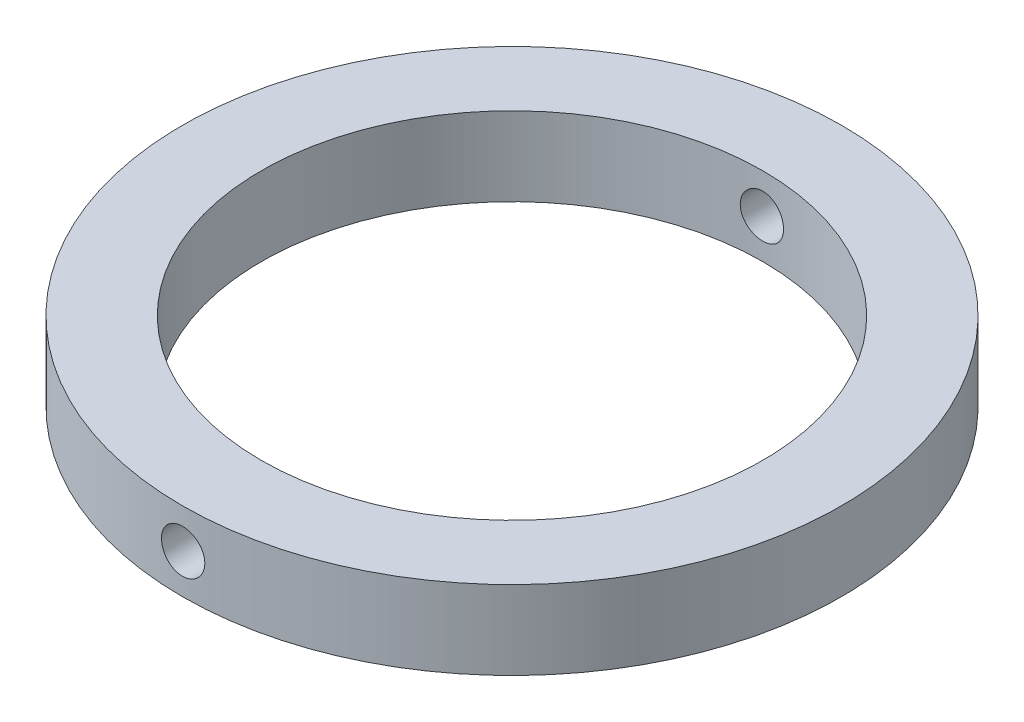
ISO-10303-21;
HEADER;
FILE_DESCRIPTION(('STEP AP214'),'2;1');
FILE_NAME('part.step','',(''),(''),'','','');
FILE_SCHEMA(('AUTOMOTIVE_DESIGN { 1 0 10303 214 1 1 1 1 }'));
ENDSEC;
DATA;
#1=APPLICATION_CONTEXT('core data for automotive mechanical design processes');
#2=APPLICATION_PROTOCOL_DEFINITION('international standard','automotive_design',2000,#1);
#3=PRODUCT_CONTEXT('',#1,'mechanical');
#4=PRODUCT('Part','Part','',(#3));
#5=PRODUCT_RELATED_PRODUCT_CATEGORY('part','',(#4));
#6=PRODUCT_DEFINITION_FORMATION('','',#4);
#7=PRODUCT_DEFINITION_CONTEXT('part definition',#1,'design');
#8=PRODUCT_DEFINITION('design','',#6,#7);
#9=PRODUCT_DEFINITION_SHAPE('','',#8);
#10=(LENGTH_UNIT() NAMED_UNIT(*) SI_UNIT(.MILLI.,.METRE.));
#11=(NAMED_UNIT(*) PLANE_ANGLE_UNIT() SI_UNIT($,.RADIAN.));
#12=(NAMED_UNIT(*) SI_UNIT($,.STERADIAN.) SOLID_ANGLE_UNIT());
#13=UNCERTAINTY_MEASURE_WITH_UNIT(LENGTH_MEASURE(1.E-05),#10,'distance_accuracy_value','');
#14=(GEOMETRIC_REPRESENTATION_CONTEXT(3) GLOBAL_UNCERTAINTY_ASSIGNED_CONTEXT((#13)) GLOBAL_UNIT_ASSIGNED_CONTEXT((#10,
#11,#12)) REPRESENTATION_CONTEXT('',''));
#15=CARTESIAN_POINT('',(0.,0.,0.));
#16=DIRECTION('',(0.,0.,1.));
#17=DIRECTION('',(1.,0.,0.));
#18=AXIS2_PLACEMENT_3D('',#15,#16,#17);
#19=CARTESIAN_POINT('',(0.,10.,0.));
#20=DIRECTION('',(0.,-1.,0.));
#21=DIRECTION('',(0.,0.,-1.));
#22=AXIS2_PLACEMENT_3D('',#19,#20,#21);
#23=CYLINDRICAL_SURFACE('',#22,41.85);
#24=CARTESIAN_POINT('',(0.,10.,0.));
#25=DIRECTION('',(0.,1.,0.));
#26=DIRECTION('',(0.,0.,1.));
#27=AXIS2_PLACEMENT_3D('',#24,#25,#26);
#28=CIRCLE('',#27,41.85);
#29=CARTESIAN_POINT('',(0.,10.,41.85));
#30=VERTEX_POINT('',#29);
#31=EDGE_CURVE('E10',#30,#30,#28,.T.);
#32=ORIENTED_EDGE('',*,*,#31,.F.);
#33=EDGE_LOOP('',(#32));
#34=FACE_BOUND('',#33,.T.);
#35=CARTESIAN_POINT('',(0.,0.,0.));
#36=DIRECTION('',(0.,1.,0.));
#37=DIRECTION('',(0.,0.,1.));
#38=AXIS2_PLACEMENT_3D('',#35,#36,#37);
#39=CIRCLE('',#38,41.85);
#40=CARTESIAN_POINT('',(0.,0.,41.85));
#41=VERTEX_POINT('',#40);
#42=EDGE_CURVE('E52',#41,#41,#39,.T.);
#43=ORIENTED_EDGE('',*,*,#42,.T.);
#44=EDGE_LOOP('',(#43));
#45=FACE_BOUND('',#44,.T.);
#46=CARTESIAN_POINT('',(0.,7.75,-41.85));
#47=CARTESIAN_POINT('',(0.154290099332612,7.74999321754741,-41.8499988011758));
#48=CARTESIAN_POINT('',(0.308687825769506,7.73697157858766,-41.8491376375957));
#49=CARTESIAN_POINT('',(0.613218841201266,7.68521323826535,-41.8457850773138));
#50=CARTESIAN_POINT('',(0.763346973857226,7.64644671476278,-41.8432917900545));
#51=CARTESIAN_POINT('',(1.05488365405529,7.54431791111544,-41.8369569989291));
#52=CARTESIAN_POINT('',(1.19629680024165,7.48096873354768,-41.8331162133853));
#53=CARTESIAN_POINT('',(1.46644583797839,7.33149442391011,-41.8245182357857));
#54=CARTESIAN_POINT('',(1.59518459769578,7.24537446111875,-41.8197612517859));
#55=CARTESIAN_POINT('',(1.83657817459748,7.05264884275964,-41.8098567335951));
#56=CARTESIAN_POINT('',(1.94920943303032,6.94601370536758,-41.804708643878));
#57=CARTESIAN_POINT('',(2.15498922700986,6.71534579064044,-41.7946068640215));
#58=CARTESIAN_POINT('',(2.24813694296539,6.59131228179512,-41.7896531820671));
#59=CARTESIAN_POINT('',(2.41237951241051,6.32923328148415,-41.7804945168638));
#60=CARTESIAN_POINT('',(2.48345457634963,6.19117536253465,-41.7762902069053));
#61=CARTESIAN_POINT('',(2.60140770033902,5.90505354364975,-41.7691116752754));
#62=CARTESIAN_POINT('',(2.64828604313305,5.75698976065784,-41.7661374392305));
#63=CARTESIAN_POINT('',(2.71644905753053,5.45528799244626,-41.7617598003493));
#64=CARTESIAN_POINT('',(2.73777093124992,5.30165844590535,-41.7603541144079));
#65=CARTESIAN_POINT('',(2.75433061301864,4.99299495634095,-41.7592652613331));
#66=CARTESIAN_POINT('',(2.74956874274023,4.8379610306602,-41.7595820729574));
#67=CARTESIAN_POINT('',(2.71412695981282,4.53114331553306,-41.7619003689473));
#68=CARTESIAN_POINT('',(2.683487327807,4.37935485056886,-41.7638992350534));
#69=CARTESIAN_POINT('',(2.59722226061068,4.08308011249805,-41.769352265633));
#70=CARTESIAN_POINT('',(2.54159666285057,3.9385938869098,-41.7728064395754));
#71=CARTESIAN_POINT('',(2.40689302759663,3.6608957926856,-41.7807838468435));
#72=CARTESIAN_POINT('',(2.32779674482857,3.5276927991685,-41.7853079113064));
#73=CARTESIAN_POINT('',(2.1484102038833,3.27643934494015,-41.7949144584274));
#74=CARTESIAN_POINT('',(2.04811968150902,3.15838907314484,-41.7999969480461));
#75=CARTESIAN_POINT('',(1.82896480218378,2.94055773694956,-41.8101592283428));
#76=CARTESIAN_POINT('',(1.71006558988451,2.8408117352164,-41.8152389956332));
#77=CARTESIAN_POINT('',(1.4571905540584,2.66269090365282,-41.8248141399912));
#78=CARTESIAN_POINT('',(1.32321472472832,2.58431608204856,-41.829309516834));
#79=CARTESIAN_POINT('',(1.04396806424317,2.45116524605297,-41.8372097464952));
#80=CARTESIAN_POINT('',(0.898696583449396,2.39639059014784,-41.8406145365338));
#81=CARTESIAN_POINT('',(0.600991973656429,2.31201851186089,-41.8459491056359));
#82=CARTESIAN_POINT('',(0.44855893711889,2.2824207645184,-41.8478789037373));
#83=CARTESIAN_POINT('',(0.141162405527342,2.24928619099311,-41.8500435844614));
#84=CARTESIAN_POINT('',(-0.0137958435674341,2.24570089380397,-41.8502816194599));
#85=CARTESIAN_POINT('',(-0.322111494498557,2.26456630211203,-41.8490443411495));
#86=CARTESIAN_POINT('',(-0.475468905551681,2.28701685762509,-41.8475690377105));
#87=CARTESIAN_POINT('',(-0.776092853861847,2.35727654288242,-41.8430731701016));
#88=CARTESIAN_POINT('',(-0.923364617797856,2.40506340308875,-41.8400539630403));
#89=CARTESIAN_POINT('',(-1.20779816693384,2.52461656904448,-41.8328098889319));
#90=CARTESIAN_POINT('',(-1.34495985170388,2.59638311296036,-41.8285850099103));
#91=CARTESIAN_POINT('',(-1.60550150430209,2.76198163226646,-41.8193963040407));
#92=CARTESIAN_POINT('',(-1.72886088017293,2.85584594490211,-41.8144313982026));
#93=CARTESIAN_POINT('',(-1.95808882318597,3.06292851796911,-41.8043248823149));
#94=CARTESIAN_POINT('',(-2.06395720041093,3.17614698852076,-41.7991832703473));
#95=CARTESIAN_POINT('',(-2.255362406773,3.41893330820694,-41.7892936761702));
#96=CARTESIAN_POINT('',(-2.34086776488973,3.54852599666441,-41.7845463105478));
#97=CARTESIAN_POINT('',(-2.4889044098989,3.82025741406678,-41.7759904323852));
#98=CARTESIAN_POINT('',(-2.5514358505387,3.96239605904303,-41.772181913562));
#99=CARTESIAN_POINT('',(-2.65169524528746,4.25507012213475,-41.7659376892427));
#100=CARTESIAN_POINT('',(-2.68944293341243,4.40559875586404,-41.7635008917372));
#101=CARTESIAN_POINT('',(-2.73912772853688,4.71087389977274,-41.7602718954646));
#102=CARTESIAN_POINT('',(-2.75106512394346,4.86562036280208,-41.7594796783207));
#103=CARTESIAN_POINT('',(-2.74878763293919,5.17462559078792,-41.7596296300074));
#104=CARTESIAN_POINT('',(-2.73462221841803,5.32888472439922,-41.7605685179271));
#105=CARTESIAN_POINT('',(-2.6806438619129,5.63282899559131,-41.7640679273305));
#106=CARTESIAN_POINT('',(-2.64083087428527,5.78251412503148,-41.7666284516999));
#107=CARTESIAN_POINT('',(-2.53669886815668,6.07306820030999,-41.7730817810187));
#108=CARTESIAN_POINT('',(-2.472380157137,6.21393725674066,-41.7769745692516));
#109=CARTESIAN_POINT('',(-2.32106902496006,6.48288400887214,-41.7856537102544));
#110=CARTESIAN_POINT('',(-2.23407715953305,6.61096201798146,-41.7904400411222));
#111=CARTESIAN_POINT('',(-2.03970545239938,6.85094240947175,-41.8003775294771));
#112=CARTESIAN_POINT('',(-1.93228965654435,6.96281564381602,-41.8055293201369));
#113=CARTESIAN_POINT('',(-1.70017112323984,7.16698201260253,-41.8156117188951));
#114=CARTESIAN_POINT('',(-1.57546416925335,7.25927035723655,-41.8205422726544));
#115=CARTESIAN_POINT('',(-1.31214821799897,7.42172256832539,-41.8296322322455));
#116=CARTESIAN_POINT('',(-1.17352108598708,7.49185706746362,-41.8337906114939));
#117=CARTESIAN_POINT('',(-0.886531552137562,7.60776872481375,-41.8408541940417));
#118=CARTESIAN_POINT('',(-0.73818075243376,7.65357433825889,-41.8437608605963));
#119=CARTESIAN_POINT('',(-0.490772188367824,7.70765506650704,-41.8472338972108));
#120=CARTESIAN_POINT('',(-0.393312628345785,7.7235138062974,-41.8482665606961));
#121=CARTESIAN_POINT('',(-0.197250043047792,7.74468843311883,-41.8496499948046));
#122=CARTESIAN_POINT('',(-0.098647019538159,7.75000433643335,-41.850000766481));
#123=CARTESIAN_POINT('',(0.,7.75,-41.85));
#124=B_SPLINE_CURVE_WITH_KNOTS('',3,(#46,#47,#48,#49,#50,#51,#52,#53,#54,#55,#56,#57,#58,#59,
#60,#61,#62,#63,#64,#65,#66,#67,#68,#69,#70,#71,#72,#73,#74,#75,#76,#77,#78,#79,#80,#81,#82,#83,
#84,#85,#86,#87,#88,#89,#90,#91,#92,#93,#94,#95,#96,#97,#98,#99,#100,#101,#102,#103,#104,#105,
#106,#107,#108,#109,#110,#111,#112,#113,#114,#115,#116,#117,#118,#119,#120,#121,#122,#123),
.UNSPECIFIED.,.T.,.F.,(4,2,2,2,2,2,2,2,2,2,2,2,2,2,2,2,2,2,2,2,2,2,2,2,2,2,2,2,2,2,2,2,2,2,2,2,
2,2,4),(0.,0.462510171268374,0.925557037819973,1.38835743821623,1.8510528666862,
2.31441825776961,2.77780313677942,3.24160227862634,3.70539600076009,4.1685137631446,
4.63162581423995,5.09401832303994,5.55641384041119,6.01916975346513,6.4819314353491,
6.94557051042958,7.40920976397302,7.87287570221902,8.33653565579533,8.79933141356662,
9.26212450533419,9.72451149430553,10.1869030758461,10.6499755608511,11.1130530735666,
11.5768416937236,12.0406272100314,12.5040429886966,12.9674535890752,13.4299868041329,
13.8925208423395,14.3550490771723,14.8175659762748,15.2809047543452,15.7443567193051,
16.2084204864863,16.6719402795252,16.9676515440041,17.2633623517557),.UNSPECIFIED.);
#125=CARTESIAN_POINT('',(0.,7.75,-41.85));
#126=VERTEX_POINT('',#125);
#127=EDGE_CURVE('E85',#126,#126,#124,.T.);
#128=ORIENTED_EDGE('',*,*,#127,.F.);
#129=EDGE_LOOP('',(#128));
#130=FACE_BOUND('',#129,.T.);
#131=CARTESIAN_POINT('',(0.,2.25,41.85));
#132=CARTESIAN_POINT('',(0.154290099332612,2.25000678245259,41.8499988011758));
#133=CARTESIAN_POINT('',(0.308687825769506,2.26302842141234,41.8491376375957));
#134=CARTESIAN_POINT('',(0.613218841201266,2.31478676173465,41.8457850773138));
#135=CARTESIAN_POINT('',(0.763346973857226,2.35355328523722,41.8432917900545));
#136=CARTESIAN_POINT('',(1.05488365405529,2.45568208888456,41.8369569989291));
#137=CARTESIAN_POINT('',(1.19629680024165,2.51903126645232,41.8331162133853));
#138=CARTESIAN_POINT('',(1.46644583797838,2.66850557608989,41.8245182357857));
#139=CARTESIAN_POINT('',(1.59518459769578,2.75462553888125,41.8197612517859));
#140=CARTESIAN_POINT('',(1.83657817459748,2.94735115724036,41.8098567335951));
#141=CARTESIAN_POINT('',(1.94920943303032,3.05398629463242,41.804708643878));
#142=CARTESIAN_POINT('',(2.15498922700985,3.28465420935956,41.7946068640215));
#143=CARTESIAN_POINT('',(2.24813694296538,3.40868771820488,41.7896531820671));
#144=CARTESIAN_POINT('',(2.41237951241051,3.67076671851585,41.7804945168638));
#145=CARTESIAN_POINT('',(2.48345457634963,3.80882463746535,41.7762902069053));
#146=CARTESIAN_POINT('',(2.60140770033902,4.09494645635025,41.7691116752755));
#147=CARTESIAN_POINT('',(2.64828604313305,4.24301023934216,41.7661374392305));
#148=CARTESIAN_POINT('',(2.71644905753053,4.54471200755374,41.7617598003493));
#149=CARTESIAN_POINT('',(2.73777093124992,4.69834155409465,41.7603541144079));
#150=CARTESIAN_POINT('',(2.75433061301864,5.00700504365905,41.7592652613331));
#151=CARTESIAN_POINT('',(2.74956874274023,5.1620389693398,41.7595820729574));
#152=CARTESIAN_POINT('',(2.71412695981282,5.46885668446694,41.7619003689473));
#153=CARTESIAN_POINT('',(2.683487327807,5.62064514943114,41.7638992350534));
#154=CARTESIAN_POINT('',(2.59722226061068,5.91691988750195,41.769352265633));
#155=CARTESIAN_POINT('',(2.54159666285057,6.0614061130902,41.7728064395754));
#156=CARTESIAN_POINT('',(2.40689302759663,6.3391042073144,41.7807838468435));
#157=CARTESIAN_POINT('',(2.32779674482857,6.4723072008315,41.7853079113064));
#158=CARTESIAN_POINT('',(2.1484102038833,6.72356065505985,41.7949144584274));
#159=CARTESIAN_POINT('',(2.04811968150902,6.84161092685516,41.7999969480461));
#160=CARTESIAN_POINT('',(1.82896480218378,7.05944226305044,41.8101592283428));
#161=CARTESIAN_POINT('',(1.71006558988451,7.1591882647836,41.8152389956332));
#162=CARTESIAN_POINT('',(1.4571905540584,7.33730909634719,41.8248141399912));
#163=CARTESIAN_POINT('',(1.32321472472832,7.41568391795145,41.829309516834));
#164=CARTESIAN_POINT('',(1.04396806424316,7.54883475394703,41.8372097464952));
#165=CARTESIAN_POINT('',(0.898696583449393,7.60360940985217,41.8406145365338));
#166=CARTESIAN_POINT('',(0.600991973656427,7.68798148813911,41.8459491056359));
#167=CARTESIAN_POINT('',(0.448558937118888,7.7175792354816,41.8478789037373));
#168=CARTESIAN_POINT('',(0.141162405527341,7.75071380900689,41.8500435844614));
#169=CARTESIAN_POINT('',(-0.013795843567435,7.75429910619603,41.8502816194599));
#170=CARTESIAN_POINT('',(-0.322111494498558,7.73543369788796,41.8490443411495));
#171=CARTESIAN_POINT('',(-0.475468905551682,7.71298314237491,41.8475690377105));
#172=CARTESIAN_POINT('',(-0.776092853861848,7.64272345711758,41.8430731701016));
#173=CARTESIAN_POINT('',(-0.923364617797856,7.59493659691124,41.8400539630403));
#174=CARTESIAN_POINT('',(-1.20779816693384,7.47538343095552,41.8328098889319));
#175=CARTESIAN_POINT('',(-1.34495985170389,7.40361688703964,41.8285850099103));
#176=CARTESIAN_POINT('',(-1.60550150430209,7.23801836773354,41.8193963040407));
#177=CARTESIAN_POINT('',(-1.72886088017293,7.14415405509789,41.8144313982026));
#178=CARTESIAN_POINT('',(-1.95808882318597,6.93707148203089,41.8043248823149));
#179=CARTESIAN_POINT('',(-2.06395720041093,6.82385301147924,41.7991832703473));
#180=CARTESIAN_POINT('',(-2.255362406773,6.58106669179306,41.7892936761702));
#181=CARTESIAN_POINT('',(-2.34086776488973,6.45147400333559,41.7845463105478));
#182=CARTESIAN_POINT('',(-2.4889044098989,6.17974258593322,41.7759904323852));
#183=CARTESIAN_POINT('',(-2.5514358505387,6.03760394095697,41.772181913562));
#184=CARTESIAN_POINT('',(-2.65169524528746,5.74492987786525,41.7659376892427));
#185=CARTESIAN_POINT('',(-2.68944293341243,5.59440124413596,41.7635008917372));
#186=CARTESIAN_POINT('',(-2.73912772853688,5.28912610022726,41.7602718954646));
#187=CARTESIAN_POINT('',(-2.75106512394346,5.13437963719792,41.7594796783207));
#188=CARTESIAN_POINT('',(-2.74878763293919,4.82537440921208,41.7596296300074));
#189=CARTESIAN_POINT('',(-2.73462221841803,4.67111527560078,41.7605685179271));
#190=CARTESIAN_POINT('',(-2.6806438619129,4.36717100440869,41.7640679273305));
#191=CARTESIAN_POINT('',(-2.64083087428527,4.21748587496852,41.7666284516999));
#192=CARTESIAN_POINT('',(-2.53669886815668,3.92693179969001,41.7730817810187));
#193=CARTESIAN_POINT('',(-2.472380157137,3.78606274325934,41.7769745692516));
#194=CARTESIAN_POINT('',(-2.32106902496006,3.51711599112786,41.7856537102544));
#195=CARTESIAN_POINT('',(-2.23407715953305,3.38903798201854,41.7904400411222));
#196=CARTESIAN_POINT('',(-2.03970545239938,3.14905759052825,41.8003775294771));
#197=CARTESIAN_POINT('',(-1.93228965654435,3.03718435618398,41.8055293201369));
#198=CARTESIAN_POINT('',(-1.70017112323984,2.83301798739747,41.8156117188951));
#199=CARTESIAN_POINT('',(-1.57546416925335,2.74072964276345,41.8205422726544));
#200=CARTESIAN_POINT('',(-1.31214821799897,2.57827743167461,41.8296322322455));
#201=CARTESIAN_POINT('',(-1.17352108598708,2.50814293253638,41.8337906114939));
#202=CARTESIAN_POINT('',(-0.886531552137561,2.39223127518625,41.8408541940417));
#203=CARTESIAN_POINT('',(-0.738180752433758,2.34642566174111,41.8437608605963));
#204=CARTESIAN_POINT('',(-0.490772188367822,2.29234493349296,41.8472338972108));
#205=CARTESIAN_POINT('',(-0.393312628345784,2.2764861937026,41.8482665606961));
#206=CARTESIAN_POINT('',(-0.197250043047792,2.25531156688117,41.8496499948046));
#207=CARTESIAN_POINT('',(-0.0986470195381588,2.24999566356665,41.850000766481));
#208=CARTESIAN_POINT('',(0.,2.25,41.85));
#209=B_SPLINE_CURVE_WITH_KNOTS('',3,(#131,#132,#133,#134,#135,#136,#137,#138,#139,#140,#141,
#142,#143,#144,#145,#146,#147,#148,#149,#150,#151,#152,#153,#154,#155,#156,#157,#158,#159,#160,
#161,#162,#163,#164,#165,#166,#167,#168,#169,#170,#171,#172,#173,#174,#175,#176,#177,#178,#179,
#180,#181,#182,#183,#184,#185,#186,#187,#188,#189,#190,#191,#192,#193,#194,#195,#196,#197,#198,
#199,#200,#201,#202,#203,#204,#205,#206,#207,#208),.UNSPECIFIED.,.T.,.F.,(4,2,2,2,2,2,2,2,2,2,2,
2,2,2,2,2,2,2,2,2,2,2,2,2,2,2,2,2,2,2,2,2,2,2,2,2,2,2,4),(0.,0.462510171268374,
0.925557037819972,1.38835743821623,1.8510528666862,2.31441825776961,2.77780313677942,
3.24160227862634,3.70539600076009,4.1685137631446,4.63162581423995,5.09401832303994,
5.5564138404112,6.01916975346513,6.4819314353491,6.94557051042958,7.40920976397302,
7.87287570221902,8.33653565579533,8.79933141356662,9.26212450533419,9.72451149430552,
10.1869030758461,10.6499755608511,11.1130530735666,11.5768416937236,12.0406272100314,
12.5040429886966,12.9674535890752,13.4299868041329,13.8925208423395,14.3550490771723,
14.8175659762748,15.2809047543452,15.7443567193051,16.2084204864863,16.6719402795252,
16.9676515440041,17.2633623517557),.UNSPECIFIED.);
#210=CARTESIAN_POINT('',(0.,2.25,41.85));
#211=VERTEX_POINT('',#210);
#212=EDGE_CURVE('E80',#211,#211,#209,.T.);
#213=ORIENTED_EDGE('',*,*,#212,.F.);
#214=EDGE_LOOP('',(#213));
#215=FACE_BOUND('',#214,.T.);
#216=ADVANCED_FACE('F39',(#34,#45,#130,#215),#23,.T.);
#217=CARTESIAN_POINT('',(0.,10.,0.));
#218=DIRECTION('',(0.,-1.,0.));
#219=DIRECTION('',(0.,0.,-1.));
#220=AXIS2_PLACEMENT_3D('',#217,#218,#219);
#221=CYLINDRICAL_SURFACE('',#220,31.85);
#222=CARTESIAN_POINT('',(-2.75,5.,31.7310573413494));
#223=CARTESIAN_POINT('',(-2.74999327464815,4.84584049601565,31.7310589144226));
#224=CARTESIAN_POINT('',(-2.73699357154665,4.69157654672714,31.7321928714091));
#225=CARTESIAN_POINT('',(-2.68532747628351,4.38731838826,31.736606035033));
#226=CARTESIAN_POINT('',(-2.64663213474048,4.2373291941343,31.7398876612308));
#227=CARTESIAN_POINT('',(-2.54470351124203,3.94607117205223,31.7482217312205));
#228=CARTESIAN_POINT('',(-2.48148430164817,3.80479739677463,31.7532731592988));
#229=CARTESIAN_POINT('',(-2.33232788089161,3.534899562146,31.7645763972289));
#230=CARTESIAN_POINT('',(-2.2463954687969,3.40627283846952,31.7708279534296));
#231=CARTESIAN_POINT('',(-2.05399729774003,3.16493405204895,31.7838463197892));
#232=CARTESIAN_POINT('',(-1.9474820254999,3.05226152397204,31.7906143481053));
#233=CARTESIAN_POINT('',(-1.71704668770947,2.84636927658259,31.8038919345023));
#234=CARTESIAN_POINT('',(-1.59312585623239,2.75315041377213,31.8104014811926));
#235=CARTESIAN_POINT('',(-1.33115995944677,2.5886790737895,31.8224402943237));
#236=CARTESIAN_POINT('',(-1.19309324009227,2.51746096437285,31.8279680213798));
#237=CARTESIAN_POINT('',(-0.9069056968956,2.39923258561946,31.8374072187792));
#238=CARTESIAN_POINT('',(-0.758785060612915,2.35222186482549,31.8413187192641));
#239=CARTESIAN_POINT('',(-0.457089061022622,2.28385696946513,31.8470762230164));
#240=CARTESIAN_POINT('',(-0.303528338819536,2.26243862520849,31.8489273915061));
#241=CARTESIAN_POINT('',(0.00501882182117302,2.24566807026574,31.8503731703412));
#242=CARTESIAN_POINT('',(0.160005231935409,2.25031534285956,31.8499678254192));
#243=CARTESIAN_POINT('',(0.46656908152606,2.28549168886173,31.8469505046951));
#244=CARTESIAN_POINT('',(0.61815450477759,2.3159517581092,31.8443444121152));
#245=CARTESIAN_POINT('',(0.914053175254278,2.40178171839297,31.8372254462699));
#246=CARTESIAN_POINT('',(1.0583663489739,2.45715186115609,31.8327125537355));
#247=CARTESIAN_POINT('',(1.33584323138206,2.59130691132313,31.8222775144266));
#248=CARTESIAN_POINT('',(1.46899195583066,2.67012266100756,31.8163535134221));
#249=CARTESIAN_POINT('',(1.72019679784698,2.84890924119656,31.8037618205292));
#250=CARTESIAN_POINT('',(1.83825258633506,2.94888053284099,31.7970941124312));
#251=CARTESIAN_POINT('',(2.05632396529513,3.16752915248568,31.7837384850792));
#252=CARTESIAN_POINT('',(2.15627943551881,3.28626645206916,31.777050570866));
#253=CARTESIAN_POINT('',(2.33484817054802,3.53886775139314,31.7644301551017));
#254=CARTESIAN_POINT('',(2.41346141582365,3.67273176497569,31.7584976542419));
#255=CARTESIAN_POINT('',(2.54711220453252,3.95182946349719,31.7480587739206));
#256=CARTESIAN_POINT('',(2.60214652871223,4.09706469776066,31.7435525892176));
#257=CARTESIAN_POINT('',(2.68703223020086,4.39476155352247,31.7364803982771));
#258=CARTESIAN_POINT('',(2.71688417644374,4.54722301167984,31.7339143482073));
#259=CARTESIAN_POINT('',(2.75048142162092,4.85451812796044,31.7310201698648));
#260=CARTESIAN_POINT('',(2.75431060405077,5.00934255003956,31.7306848509798));
#261=CARTESIAN_POINT('',(2.73597345143062,5.3174310568115,31.7322711236076));
#262=CARTESIAN_POINT('',(2.71380737695708,5.47069515712945,31.7341926924974));
#263=CARTESIAN_POINT('',(2.64417889687599,5.77107098179408,31.7400696752922));
#264=CARTESIAN_POINT('',(2.59675572405191,5.91819186744002,31.7440219345159));
#265=CARTESIAN_POINT('',(2.47799912923418,6.20238899144874,31.7535123735878));
#266=CARTESIAN_POINT('',(2.40666529591761,6.33946505696616,31.7590505807179));
#267=CARTESIAN_POINT('',(2.24190038136812,6.60006505821274,31.7711063296561));
#268=CARTESIAN_POINT('',(2.1484134541417,6.72355356968299,31.7776263310862));
#269=CARTESIAN_POINT('',(1.94207665527807,6.95311484952063,31.7909027590321));
#270=CARTESIAN_POINT('',(1.8292264261439,7.05918729627136,31.7976591899113));
#271=CARTESIAN_POINT('',(1.58700370234072,7.25119225482805,31.810668658439));
#272=CARTESIAN_POINT('',(1.45758789106498,7.33707022817078,31.8169203036362));
#273=CARTESIAN_POINT('',(1.18612315787096,7.48587408933383,31.8281957061433));
#274=CARTESIAN_POINT('',(1.04407437016561,7.54880022095864,31.8332194764959));
#275=CARTESIAN_POINT('',(0.751570508204358,7.64982070348671,31.8414666990844));
#276=CARTESIAN_POINT('',(0.601127107571805,7.68794864847193,31.8446925860594));
#277=CARTESIAN_POINT('',(0.295944795518786,7.73840021616356,31.8489904759385));
#278=CARTESIAN_POINT('',(0.141205972046326,7.75072436680371,31.8500625229091));
#279=CARTESIAN_POINT('',(-0.167637446277073,7.74921214424712,31.8499319952806));
#280=CARTESIAN_POINT('',(-0.321742467255064,7.7354607107719,31.8487368060684));
#281=CARTESIAN_POINT('',(-0.625445443258189,7.68236496584218,31.8442206936679));
#282=CARTESIAN_POINT('',(-0.775043392540225,7.64302062177757,31.8408997677709));
#283=CARTESIAN_POINT('',(-1.06549013508529,7.53987782732285,31.8325046985461));
#284=CARTESIAN_POINT('',(-1.20633953398274,7.47608107189313,31.8274306767395));
#285=CARTESIAN_POINT('',(-1.47534270404746,7.32585399370545,31.8160967269572));
#286=CARTESIAN_POINT('',(-1.6034966546161,7.23942399084437,31.8098368157432));
#287=CARTESIAN_POINT('',(-1.84390600471211,7.04606491238456,31.7968091830154));
#288=CARTESIAN_POINT('',(-1.95611068712053,6.93907288104674,31.7900399418284));
#289=CARTESIAN_POINT('',(-2.16101625771548,6.70774295195354,31.776769524567));
#290=CARTESIAN_POINT('',(-2.25371242350905,6.58340086638658,31.7702684137041));
#291=CARTESIAN_POINT('',(-2.41710502678074,6.32064191524708,31.7582563957142));
#292=CARTESIAN_POINT('',(-2.48775746720019,6.18219762403014,31.7527474780476));
#293=CARTESIAN_POINT('',(-2.60472246990605,5.89545686619147,31.7433677433779));
#294=CARTESIAN_POINT('',(-2.65106292731057,5.74717191169485,31.7394950499996));
#295=CARTESIAN_POINT('',(-2.70632720341545,5.49834821555678,31.7348190087192));
#296=CARTESIAN_POINT('',(-2.7226826302574,5.39940827165375,31.7334148990026));
#297=CARTESIAN_POINT('',(-2.74452119799387,5.20032692020612,31.7315335555169));
#298=CARTESIAN_POINT('',(-2.7500043706864,5.10018551617629,31.731056319037));
#299=CARTESIAN_POINT('',(-2.75,5.,31.7310573413494));
#300=B_SPLINE_CURVE_WITH_KNOTS('',3,(#222,#223,#224,#225,#226,#227,#228,#229,#230,#231,#232,
#233,#234,#235,#236,#237,#238,#239,#240,#241,#242,#243,#244,#245,#246,#247,#248,#249,#250,#251,
#252,#253,#254,#255,#256,#257,#258,#259,#260,#261,#262,#263,#264,#265,#266,#267,#268,#269,#270,
#271,#272,#273,#274,#275,#276,#277,#278,#279,#280,#281,#282,#283,#284,#285,#286,#287,#288,#289,
#290,#291,#292,#293,#294,#295,#296,#297,#298,#299),.UNSPECIFIED.,.T.,.F.,(4,2,2,2,2,2,2,2,2,2,2,
2,2,2,2,2,2,2,2,2,2,2,2,2,2,2,2,2,2,2,2,2,2,2,2,2,2,2,4),(0.,0.462112705360054,
0.924746924340231,1.38711606488685,1.84938758953781,2.31278529900263,2.77620340654652,
3.24034180901255,3.70447155518614,4.16743509539441,4.63038945792978,5.09211011578676,
5.55383543963074,6.0161708613664,6.47851636193874,6.94237044972626,7.40622496197712,
7.87014278457981,8.33405012581831,8.79646136522111,9.25886796945324,9.72055838640998,
10.1822567459997,10.6451316261677,11.1080150531308,11.5721345723688,12.0362491613828,
12.4997336978986,12.9632087516416,13.4251766550231,13.8871451470381,14.3490816227126,
14.8110115697586,15.2743790349292,15.7378585379751,16.2022572677746,16.6661219832883,
16.9664416789713,17.2667604963101),.UNSPECIFIED.);
#301=CARTESIAN_POINT('',(-2.75,5.,31.7310573413494));
#302=VERTEX_POINT('',#301);
#303=EDGE_CURVE('E62',#302,#302,#300,.T.);
#304=ORIENTED_EDGE('',*,*,#303,.T.);
#305=EDGE_LOOP('',(#304));
#306=FACE_BOUND('',#305,.T.);
#307=CARTESIAN_POINT('',(0.,10.,0.));
#308=DIRECTION('',(0.,1.,0.));
#309=DIRECTION('',(0.,0.,1.));
#310=AXIS2_PLACEMENT_3D('',#307,#308,#309);
#311=CIRCLE('',#310,31.85);
#312=CARTESIAN_POINT('',(0.,10.,31.85));
#313=VERTEX_POINT('',#312);
#314=EDGE_CURVE('E57',#313,#313,#311,.T.);
#315=ORIENTED_EDGE('',*,*,#314,.T.);
#316=EDGE_LOOP('',(#315));
#317=FACE_BOUND('',#316,.T.);
#318=CARTESIAN_POINT('',(0.,0.,0.));
#319=DIRECTION('',(0.,1.,0.));
#320=DIRECTION('',(0.,0.,1.));
#321=AXIS2_PLACEMENT_3D('',#318,#319,#320);
#322=CIRCLE('',#321,31.85);
#323=CARTESIAN_POINT('',(0.,0.,31.85));
#324=VERTEX_POINT('',#323);
#325=EDGE_CURVE('E60',#324,#324,#322,.T.);
#326=ORIENTED_EDGE('',*,*,#325,.F.);
#327=EDGE_LOOP('',(#326));
#328=FACE_BOUND('',#327,.T.);
#329=CARTESIAN_POINT('',(0.,7.75,-31.85));
#330=CARTESIAN_POINT('',(0.154160711688694,7.74999327573487,-31.84999844859));
#331=CARTESIAN_POINT('',(0.308425864777486,7.73699337583557,-31.8488688191871));
#332=CARTESIAN_POINT('',(0.612686524472508,7.68532642779682,-31.8444711161383));
#333=CARTESIAN_POINT('',(0.762677016970373,7.64663043442406,-31.8412006309955));
#334=CARTESIAN_POINT('',(1.05393778419342,7.54469990403076,-31.8328907301448));
#335=CARTESIAN_POINT('',(1.19521299524477,7.48147940834501,-31.8278523268035));
#336=CARTESIAN_POINT('',(1.46511323449966,7.33231995914836,-31.8165713436228));
#337=CARTESIAN_POINT('',(1.59374092882777,7.246385807874,-31.8103290183979));
#338=CARTESIAN_POINT('',(1.83507861470681,7.0539858818632,-31.7973214392859));
#339=CARTESIAN_POINT('',(1.94774938010586,6.94747098222139,-31.7905549578983));
#340=CARTESIAN_POINT('',(2.15363822678924,6.71703712912234,-31.7772719652155));
#341=CARTESIAN_POINT('',(2.24685544616681,6.59311740493555,-31.7707554650062));
#342=CARTESIAN_POINT('',(2.41132507112396,6.3311524738654,-31.7586971878124));
#343=CARTESIAN_POINT('',(2.48254280613814,6.19308542255693,-31.7531569552402));
#344=CARTESIAN_POINT('',(2.60077040106156,5.90689715773979,-31.7436927844594));
#345=CARTESIAN_POINT('',(2.64778071689471,5.75877613364769,-31.7397688158103));
#346=CARTESIAN_POINT('',(2.7161447608434,5.45707896494112,-31.7339919315559));
#347=CARTESIAN_POINT('',(2.73756262500762,5.30351745419212,-31.7321338395704));
#348=CARTESIAN_POINT('',(2.754331946575,4.99496875094251,-31.730682786062));
#349=CARTESIAN_POINT('',(2.74968392585372,4.83998158704749,-31.7310897791891));
#350=CARTESIAN_POINT('',(2.71450639934633,4.5334210474295,-31.7341182023035));
#351=CARTESIAN_POINT('',(2.68404665069307,4.38183959993317,-31.7367336637574));
#352=CARTESIAN_POINT('',(2.59821871124652,4.08594871558314,-31.7438749713274));
#353=CARTESIAN_POINT('',(2.54285026151253,3.94163935434443,-31.7484008373034));
#354=CARTESIAN_POINT('',(2.40869870872137,3.66416707809035,-31.758859871553));
#355=CARTESIAN_POINT('',(2.32988436701836,3.53101933981163,-31.7647949152322));
#356=CARTESIAN_POINT('',(2.15110078752461,3.27981587222059,-31.7774018682047));
#357=CARTESIAN_POINT('',(2.05113108936129,3.16176047143009,-31.7840737935322));
#358=CARTESIAN_POINT('',(1.83248359505348,2.94368727775178,-31.7974293101516));
#359=CARTESIAN_POINT('',(1.71374550324795,2.84372992728136,-31.8041128679133));
#360=CARTESIAN_POINT('',(1.46114195073671,2.66515777680224,-31.816717759056));
#361=CARTESIAN_POINT('',(1.32727647891893,2.58654299247122,-31.8226390918771));
#362=CARTESIAN_POINT('',(1.04817839587505,2.45289109848436,-31.8330536161029));
#363=CARTESIAN_POINT('',(0.902944464952004,2.39785673095389,-31.8375466413966));
#364=CARTESIAN_POINT('',(0.60525044059339,2.31297054290626,-31.8445964454262));
#365=CARTESIAN_POINT('',(0.452790508243109,2.2831181612995,-31.8471532673032));
#366=CARTESIAN_POINT('',(0.145496085024496,2.24951927556463,-31.8500370430097));
#367=CARTESIAN_POINT('',(-0.00932921502839454,2.24568929833588,-31.8503711267329));
#368=CARTESIAN_POINT('',(-0.317419669063905,2.26402517477646,-31.8487908392367));
#369=CARTESIAN_POINT('',(-0.470684838670087,2.28619076786038,-31.8468764905559));
#370=CARTESIAN_POINT('',(-0.771065897425189,2.35581938869476,-31.8410191813826));
#371=CARTESIAN_POINT('',(-0.918190836152436,2.4032436596718,-31.8370793291323));
#372=CARTESIAN_POINT('',(-1.20239558003994,2.52200380926862,-31.8276135018025));
#373=CARTESIAN_POINT('',(-1.33947521507072,2.59334009275353,-31.8220874998676));
#374=CARTESIAN_POINT('',(-1.60007762302888,2.75810859928805,-31.8100508371899));
#375=CARTESIAN_POINT('',(-1.72356536580123,2.85159604552604,-31.8035377304444));
#376=CARTESIAN_POINT('',(-1.95312485268441,3.05793343907809,-31.7902665986915));
#377=CARTESIAN_POINT('',(-2.05919627183796,3.17078374758801,-31.7835085691172));
#378=CARTESIAN_POINT('',(-2.25119904603059,3.41300601752431,-31.770488098422));
#379=CARTESIAN_POINT('',(-2.33707587711378,3.54242128250821,-31.7642270285407));
#380=CARTESIAN_POINT('',(-2.48587773341753,3.81388462197338,-31.7529290672545));
#381=CARTESIAN_POINT('',(-2.54880300219181,3.95593256238135,-31.7478921628594));
#382=CARTESIAN_POINT('',(-2.6498229061296,4.2484369885384,-31.739620692984));
#383=CARTESIAN_POINT('',(-2.68795076163591,4.39888193029056,-31.7363837170412));
#384=CARTESIAN_POINT('',(-2.73840162803617,4.7040674896712,-31.7320706503479));
#385=CARTESIAN_POINT('',(-2.75072517507427,4.85880801798124,-31.7309945147009));
#386=CARTESIAN_POINT('',(-2.74921120694987,5.16765037150319,-31.7311256815408));
#387=CARTESIAN_POINT('',(-2.73545935687052,5.32175262705398,-31.7323255068551));
#388=CARTESIAN_POINT('',(-2.68236375226722,5.62544996906493,-31.7368575097326));
#389=CARTESIAN_POINT('',(-2.64301996022528,5.7750450489172,-31.7401896904219));
#390=CARTESIAN_POINT('',(-2.53987933564643,6.06548609421889,-31.7486089664395));
#391=CARTESIAN_POINT('',(-2.47608421639597,6.20633267186605,-31.7536959388083));
#392=CARTESIAN_POINT('',(-2.32586128276882,6.47533088328826,-31.7650518405798));
#393=CARTESIAN_POINT('',(-2.23943378518229,6.60348269472001,-31.7713207534382));
#394=CARTESIAN_POINT('',(-2.04607744533002,6.84389220983453,-31.7843587207047));
#395=CARTESIAN_POINT('',(-1.93908507551888,6.95609873792204,-31.7911292838743));
#396=CARTESIAN_POINT('',(-1.70775371240829,7.16100787407884,-31.8043938827875));
#397=CARTESIAN_POINT('',(-1.58341053539577,7.25370576456648,-31.8108878513427));
#398=CARTESIAN_POINT('',(-1.32065071192741,7.41710020460731,-31.8228801361868));
#399=CARTESIAN_POINT('',(-1.18220683559476,7.4877530720115,-31.8283764667626));
#400=CARTESIAN_POINT('',(-0.895466961196479,7.60471898826011,-31.8377312499362));
#401=CARTESIAN_POINT('',(-0.747182472670694,7.65105992615585,-31.8415915782666));
#402=CARTESIAN_POINT('',(-0.498357488729707,7.70632556904714,-31.8462519024236));
#403=CARTESIAN_POINT('',(-0.399415694369157,7.72268161085574,-31.8476510145148));
#404=CARTESIAN_POINT('',(-0.200330634840067,7.7445209956516,-31.849525566092));
#405=CARTESIAN_POINT('',(-0.100187373140855,7.75000437002692,-31.8500010082445));
#406=CARTESIAN_POINT('',(0.,7.75,-31.85));
#407=B_SPLINE_CURVE_WITH_KNOTS('',3,(#329,#330,#331,#332,#333,#334,#335,#336,#337,#338,#339,
#340,#341,#342,#343,#344,#345,#346,#347,#348,#349,#350,#351,#352,#353,#354,#355,#356,#357,#358,
#359,#360,#361,#362,#363,#364,#365,#366,#367,#368,#369,#370,#371,#372,#373,#374,#375,#376,#377,
#378,#379,#380,#381,#382,#383,#384,#385,#386,#387,#388,#389,#390,#391,#392,#393,#394,#395,#396,
#397,#398,#399,#400,#401,#402,#403,#404,#405,#406),.UNSPECIFIED.,.T.,.F.,(4,2,2,2,2,2,2,2,2,2,2,
2,2,2,2,2,2,2,2,2,2,2,2,2,2,2,2,2,2,2,2,2,2,2,2,2,2,2,4),(0.,0.462116332816217,
0.924754099241743,1.38712737561934,1.84940297277589,2.31279593576402,2.77620942543522,
3.24034955893634,3.70448095047615,4.16744674810173,4.63040327653595,5.09211262369932,
5.55382677071545,6.0161588691219,6.47850102960945,6.94235989299105,7.40621909711001,
7.87013222797326,8.33403502193523,8.79644903099454,9.25885840475182,9.72056029561364,
10.1822700041545,10.6451431029448,11.1080248371336,11.5721423272268,12.0362548921288,
12.4997444117364,12.9632243011825,13.4251841653088,13.8871447066736,14.3490728847204,
14.8109945974069,15.2743668707224,15.7378510683628,16.2022479103736,16.666110855473,
16.9664361109875,17.2667604994986),.UNSPECIFIED.);
#408=CARTESIAN_POINT('',(0.,7.75,-31.85));
#409=VERTEX_POINT('',#408);
#410=EDGE_CURVE('E43',#409,#409,#407,.T.);
#411=ORIENTED_EDGE('',*,*,#410,.T.);
#412=EDGE_LOOP('',(#411));
#413=FACE_BOUND('',#412,.T.);
#414=ADVANCED_FACE('F67',(#306,#317,#328,#413),#221,.F.);
#415=CARTESIAN_POINT('',(0.,10.,0.));
#416=DIRECTION('',(0.,1.,0.));
#417=DIRECTION('',(0.,0.,1.));
#418=AXIS2_PLACEMENT_3D('',#415,#416,#417);
#419=PLANE('',#418);
#420=ORIENTED_EDGE('',*,*,#31,.T.);
#421=EDGE_LOOP('',(#420));
#422=FACE_BOUND('',#421,.T.);
#423=ORIENTED_EDGE('',*,*,#314,.F.);
#424=EDGE_LOOP('',(#423));
#425=FACE_BOUND('',#424,.T.);
#426=ADVANCED_FACE('F100',(#422,#425),#419,.T.);
#427=CARTESIAN_POINT('',(0.,0.,0.));
#428=DIRECTION('',(0.,1.,0.));
#429=DIRECTION('',(0.,0.,1.));
#430=AXIS2_PLACEMENT_3D('',#427,#428,#429);
#431=PLANE('',#430);
#432=ORIENTED_EDGE('',*,*,#42,.F.);
#433=EDGE_LOOP('',(#432));
#434=FACE_BOUND('',#433,.T.);
#435=ORIENTED_EDGE('',*,*,#325,.T.);
#436=EDGE_LOOP('',(#435));
#437=FACE_BOUND('',#436,.T.);
#438=ADVANCED_FACE('F96',(#434,#437),#431,.F.);
#439=CARTESIAN_POINT('',(0.,5.,41.85));
#440=DIRECTION('',(0.,0.,-1.));
#441=DIRECTION('',(-1.,0.,0.));
#442=AXIS2_PLACEMENT_3D('',#439,#440,#441);
#443=CYLINDRICAL_SURFACE('',#442,2.75);
#444=ORIENTED_EDGE('',*,*,#303,.F.);
#445=EDGE_LOOP('',(#444));
#446=FACE_BOUND('',#445,.T.);
#447=ORIENTED_EDGE('',*,*,#212,.T.);
#448=EDGE_LOOP('',(#447));
#449=FACE_BOUND('',#448,.T.);
#450=ADVANCED_FACE('F73',(#446,#449),#443,.F.);
#451=ORIENTED_EDGE('',*,*,#410,.F.);
#452=EDGE_LOOP('',(#451));
#453=FACE_BOUND('',#452,.T.);
#454=ORIENTED_EDGE('',*,*,#127,.T.);
#455=EDGE_LOOP('',(#454));
#456=FACE_BOUND('',#455,.T.);
#457=ADVANCED_FACE('F70',(#453,#456),#443,.F.);
#458=CLOSED_SHELL('',(#216,#414,#426,#438,#450,#457));
#459=MANIFOLD_SOLID_BREP('B2',#458);
#460=ADVANCED_BREP_SHAPE_REPRESENTATION('',(#18,#459),#14);
#461=SHAPE_DEFINITION_REPRESENTATION(#9,#460);
ENDSEC;
END-ISO-10303-21;
